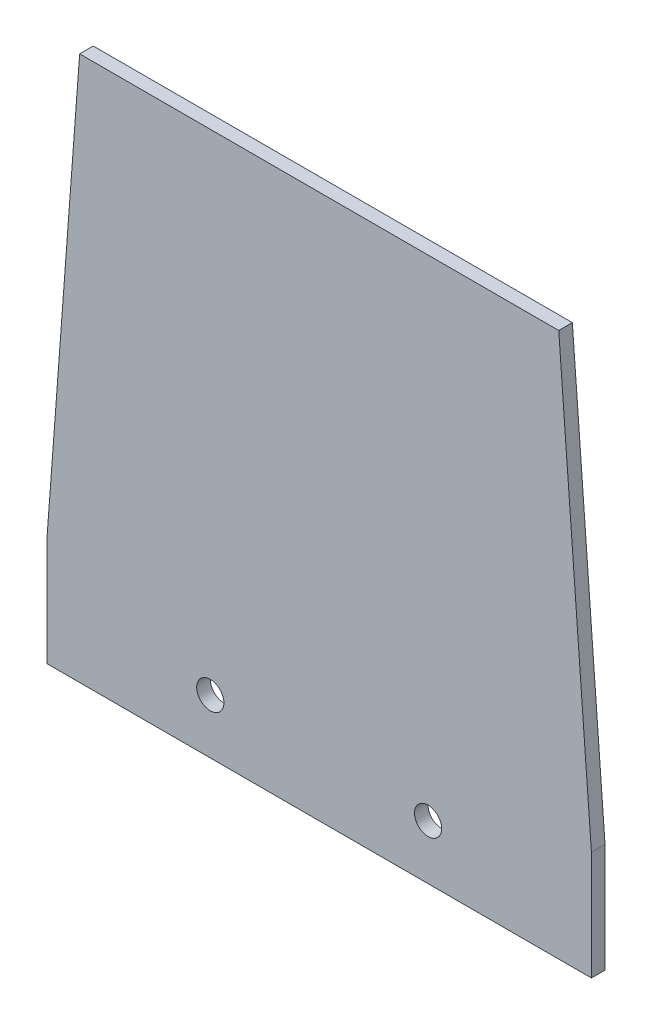
ISO-10303-21;
HEADER;
FILE_DESCRIPTION(('STEP AP214'),'2;1');
FILE_NAME('part.step','',(''),(''),'','','');
FILE_SCHEMA(('AUTOMOTIVE_DESIGN { 1 0 10303 214 1 1 1 1 }'));
ENDSEC;
DATA;
#1=APPLICATION_CONTEXT('core data for automotive mechanical design processes');
#2=APPLICATION_PROTOCOL_DEFINITION('international standard','automotive_design',2000,#1);
#3=PRODUCT_CONTEXT('',#1,'mechanical');
#4=PRODUCT('Part','Part','',(#3));
#5=PRODUCT_RELATED_PRODUCT_CATEGORY('part','',(#4));
#6=PRODUCT_DEFINITION_FORMATION('','',#4);
#7=PRODUCT_DEFINITION_CONTEXT('part definition',#1,'design');
#8=PRODUCT_DEFINITION('design','',#6,#7);
#9=PRODUCT_DEFINITION_SHAPE('','',#8);
#10=(LENGTH_UNIT() NAMED_UNIT(*) SI_UNIT(.MILLI.,.METRE.));
#11=(NAMED_UNIT(*) PLANE_ANGLE_UNIT() SI_UNIT($,.RADIAN.));
#12=(NAMED_UNIT(*) SI_UNIT($,.STERADIAN.) SOLID_ANGLE_UNIT());
#13=UNCERTAINTY_MEASURE_WITH_UNIT(LENGTH_MEASURE(1.E-05),#10,'distance_accuracy_value','');
#14=(GEOMETRIC_REPRESENTATION_CONTEXT(3) GLOBAL_UNCERTAINTY_ASSIGNED_CONTEXT((#13)) GLOBAL_UNIT_ASSIGNED_CONTEXT((#10,
#11,#12)) REPRESENTATION_CONTEXT('',''));
#15=CARTESIAN_POINT('',(0.,0.,0.));
#16=DIRECTION('',(0.,0.,1.));
#17=DIRECTION('',(1.,0.,0.));
#18=AXIS2_PLACEMENT_3D('',#15,#16,#17);
#19=CARTESIAN_POINT('',(57.4617775015538,4.30963331261663,3.175));
#20=DIRECTION('',(0.997199309888456,0.074789948241636,0.));
#21=DIRECTION('',(-0.074789948241636,0.997199309888456,0.));
#22=AXIS2_PLACEMENT_3D('',#19,#20,#21);
#23=PLANE('',#22);
#24=DIRECTION('',(0.074789948241636,-0.997199309888456,0.));
#25=VECTOR('',#24,1.);
#26=CARTESIAN_POINT('',(57.4617775015538,4.30963331261663,0.));
#27=LINE('',#26,#25);
#28=CARTESIAN_POINT('',(55.88,25.4,0.));
#29=VERTEX_POINT('',#28);
#30=CARTESIAN_POINT('',(63.5000000000002,-76.2000000000004,0.));
#31=VERTEX_POINT('',#30);
#32=EDGE_CURVE('E116',#29,#31,#27,.T.);
#33=ORIENTED_EDGE('',*,*,#32,.F.);
#34=DIRECTION('',(0.,0.,-1.));
#35=VECTOR('',#34,1.);
#36=CARTESIAN_POINT('',(55.88,25.4,3.175));
#37=LINE('',#36,#35);
#38=CARTESIAN_POINT('',(55.88,25.4,3.175));
#39=VERTEX_POINT('',#38);
#40=EDGE_CURVE('E11',#39,#29,#37,.T.);
#41=ORIENTED_EDGE('',*,*,#40,.F.);
#42=DIRECTION('',(0.074789948241636,-0.997199309888456,0.));
#43=VECTOR('',#42,1.);
#44=CARTESIAN_POINT('',(57.4617775015538,4.30963331261663,3.175));
#45=LINE('',#44,#43);
#46=CARTESIAN_POINT('',(63.5000000000002,-76.2000000000004,3.175));
#47=VERTEX_POINT('',#46);
#48=EDGE_CURVE('E131',#39,#47,#45,.T.);
#49=ORIENTED_EDGE('',*,*,#48,.T.);
#50=DIRECTION('',(0.,0.,-1.));
#51=VECTOR('',#50,1.);
#52=CARTESIAN_POINT('',(63.5000000000002,-76.2000000000004,3.175));
#53=LINE('',#52,#51);
#54=EDGE_CURVE('E51',#47,#31,#53,.T.);
#55=ORIENTED_EDGE('',*,*,#54,.T.);
#56=EDGE_LOOP('',(#33,#41,#49,#55));
#57=FACE_BOUND('',#56,.T.);
#58=ADVANCED_FACE('F35',(#57),#23,.T.);
#59=CARTESIAN_POINT('',(0.,25.4,3.175));
#60=DIRECTION('',(0.,1.,0.));
#61=DIRECTION('',(-1.,0.,0.));
#62=AXIS2_PLACEMENT_3D('',#59,#60,#61);
#63=PLANE('',#62);
#64=DIRECTION('',(1.,0.,0.));
#65=VECTOR('',#64,1.);
#66=CARTESIAN_POINT('',(0.,25.4,0.));
#67=LINE('',#66,#65);
#68=CARTESIAN_POINT('',(-55.88,25.4,0.));
#69=VERTEX_POINT('',#68);
#70=EDGE_CURVE('E118',#69,#29,#67,.T.);
#71=ORIENTED_EDGE('',*,*,#70,.F.);
#72=DIRECTION('',(0.,0.,-1.));
#73=VECTOR('',#72,1.);
#74=CARTESIAN_POINT('',(-55.88,25.4,3.175));
#75=LINE('',#74,#73);
#76=CARTESIAN_POINT('',(-55.88,25.4,3.175));
#77=VERTEX_POINT('',#76);
#78=EDGE_CURVE('E43',#77,#69,#75,.T.);
#79=ORIENTED_EDGE('',*,*,#78,.F.);
#80=DIRECTION('',(1.,0.,0.));
#81=VECTOR('',#80,1.);
#82=CARTESIAN_POINT('',(0.,25.4,3.175));
#83=LINE('',#82,#81);
#84=EDGE_CURVE('E232',#77,#39,#83,.T.);
#85=ORIENTED_EDGE('',*,*,#84,.T.);
#86=ORIENTED_EDGE('',*,*,#40,.T.);
#87=EDGE_LOOP('',(#71,#79,#85,#86));
#88=FACE_BOUND('',#87,.T.);
#89=ADVANCED_FACE('F140',(#88),#63,.T.);
#90=CARTESIAN_POINT('',(-57.4617775015538,4.30963331261638,3.175));
#91=DIRECTION('',(-0.997199309888457,0.0747899482416317,0.));
#92=DIRECTION('',(-0.0747899482416317,-0.997199309888457,0.));
#93=AXIS2_PLACEMENT_3D('',#90,#91,#92);
#94=PLANE('',#93);
#95=DIRECTION('',(0.0747899482416317,0.997199309888457,0.));
#96=VECTOR('',#95,1.);
#97=CARTESIAN_POINT('',(-57.4617775015538,4.30963331261638,0.));
#98=LINE('',#97,#96);
#99=CARTESIAN_POINT('',(-63.4999999999998,-76.2000000000004,0.));
#100=VERTEX_POINT('',#99);
#101=EDGE_CURVE('E122',#100,#69,#98,.T.);
#102=ORIENTED_EDGE('',*,*,#101,.F.);
#103=DIRECTION('',(0.,0.,-1.));
#104=VECTOR('',#103,1.);
#105=CARTESIAN_POINT('',(-63.4999999999998,-76.2000000000004,3.175));
#106=LINE('',#105,#104);
#107=CARTESIAN_POINT('',(-63.4999999999998,-76.2000000000004,3.175));
#108=VERTEX_POINT('',#107);
#109=EDGE_CURVE('E98',#108,#100,#106,.T.);
#110=ORIENTED_EDGE('',*,*,#109,.F.);
#111=DIRECTION('',(0.0747899482416317,0.997199309888457,0.));
#112=VECTOR('',#111,1.);
#113=CARTESIAN_POINT('',(-57.4617775015538,4.30963331261638,3.175));
#114=LINE('',#113,#112);
#115=EDGE_CURVE('E108',#108,#77,#114,.T.);
#116=ORIENTED_EDGE('',*,*,#115,.T.);
#117=ORIENTED_EDGE('',*,*,#78,.T.);
#118=EDGE_LOOP('',(#102,#110,#116,#117));
#119=FACE_BOUND('',#118,.T.);
#120=ADVANCED_FACE('F137',(#119),#94,.T.);
#121=CARTESIAN_POINT('',(-63.4999999999992,5.55111512312582E-13,3.175));
#122=DIRECTION('',(-1.,0.,0.));
#123=DIRECTION('',(0.,-1.,0.));
#124=AXIS2_PLACEMENT_3D('',#121,#122,#123);
#125=PLANE('',#124);
#126=DIRECTION('',(0.,1.,0.));
#127=VECTOR('',#126,1.);
#128=CARTESIAN_POINT('',(-63.4999999999992,5.55111512312582E-13,0.));
#129=LINE('',#128,#127);
#130=CARTESIAN_POINT('',(-63.5,-101.6,0.));
#131=VERTEX_POINT('',#130);
#132=EDGE_CURVE('E94',#131,#100,#129,.T.);
#133=ORIENTED_EDGE('',*,*,#132,.F.);
#134=DIRECTION('',(0.,0.,-1.));
#135=VECTOR('',#134,1.);
#136=CARTESIAN_POINT('',(-63.5,-101.6,3.175));
#137=LINE('',#136,#135);
#138=CARTESIAN_POINT('',(-63.5,-101.6,3.175));
#139=VERTEX_POINT('',#138);
#140=EDGE_CURVE('E89',#139,#131,#137,.T.);
#141=ORIENTED_EDGE('',*,*,#140,.F.);
#142=DIRECTION('',(0.,1.,0.));
#143=VECTOR('',#142,1.);
#144=CARTESIAN_POINT('',(-63.4999999999992,5.55111512312582E-13,3.175));
#145=LINE('',#144,#143);
#146=EDGE_CURVE('E92',#139,#108,#145,.T.);
#147=ORIENTED_EDGE('',*,*,#146,.T.);
#148=ORIENTED_EDGE('',*,*,#109,.T.);
#149=EDGE_LOOP('',(#133,#141,#147,#148));
#150=FACE_BOUND('',#149,.T.);
#151=ADVANCED_FACE('F91',(#150),#125,.T.);
#152=CARTESIAN_POINT('',(0.,-101.6,3.175));
#153=DIRECTION('',(0.,-1.,0.));
#154=DIRECTION('',(0.,0.,-1.));
#155=AXIS2_PLACEMENT_3D('',#152,#153,#154);
#156=PLANE('',#155);
#157=DIRECTION('',(-1.,0.,0.));
#158=VECTOR('',#157,1.);
#159=CARTESIAN_POINT('',(0.,-101.6,0.));
#160=LINE('',#159,#158);
#161=CARTESIAN_POINT('',(63.4999999999999,-101.6,0.));
#162=VERTEX_POINT('',#161);
#163=EDGE_CURVE('E126',#162,#131,#160,.T.);
#164=ORIENTED_EDGE('',*,*,#163,.F.);
#165=DIRECTION('',(0.,0.,-1.));
#166=VECTOR('',#165,1.);
#167=CARTESIAN_POINT('',(63.4999999999999,-101.6,3.175));
#168=LINE('',#167,#166);
#169=CARTESIAN_POINT('',(63.4999999999999,-101.6,3.175));
#170=VERTEX_POINT('',#169);
#171=EDGE_CURVE('E70',#170,#162,#168,.T.);
#172=ORIENTED_EDGE('',*,*,#171,.F.);
#173=DIRECTION('',(-1.,0.,0.));
#174=VECTOR('',#173,1.);
#175=CARTESIAN_POINT('',(0.,-101.6,3.175));
#176=LINE('',#175,#174);
#177=EDGE_CURVE('E105',#170,#139,#176,.T.);
#178=ORIENTED_EDGE('',*,*,#177,.T.);
#179=ORIENTED_EDGE('',*,*,#140,.T.);
#180=EDGE_LOOP('',(#164,#172,#178,#179));
#181=FACE_BOUND('',#180,.T.);
#182=ADVANCED_FACE('F110',(#181),#156,.T.);
#183=CARTESIAN_POINT('',(63.500000000001,-6.93889390390748E-13,3.175));
#184=DIRECTION('',(1.,0.,0.));
#185=DIRECTION('',(0.,1.,0.));
#186=AXIS2_PLACEMENT_3D('',#183,#184,#185);
#187=PLANE('',#186);
#188=DIRECTION('',(0.,-1.,0.));
#189=VECTOR('',#188,1.);
#190=CARTESIAN_POINT('',(63.500000000001,-6.93889390390748E-13,0.));
#191=LINE('',#190,#189);
#192=EDGE_CURVE('E128',#31,#162,#191,.T.);
#193=ORIENTED_EDGE('',*,*,#192,.F.);
#194=ORIENTED_EDGE('',*,*,#54,.F.);
#195=DIRECTION('',(0.,-1.,0.));
#196=VECTOR('',#195,1.);
#197=CARTESIAN_POINT('',(63.500000000001,-6.93889390390748E-13,3.175));
#198=LINE('',#197,#196);
#199=EDGE_CURVE('E111',#47,#170,#198,.T.);
#200=ORIENTED_EDGE('',*,*,#199,.T.);
#201=ORIENTED_EDGE('',*,*,#171,.T.);
#202=EDGE_LOOP('',(#193,#194,#200,#201));
#203=FACE_BOUND('',#202,.T.);
#204=ADVANCED_FACE('F143',(#203),#187,.T.);
#205=CARTESIAN_POINT('',(0.,0.,3.175));
#206=DIRECTION('',(0.,0.,1.));
#207=DIRECTION('',(1.,0.,0.));
#208=AXIS2_PLACEMENT_3D('',#205,#206,#207);
#209=PLANE('',#208);
#210=CARTESIAN_POINT('',(25.4,-88.9,3.175));
#211=DIRECTION('',(0.,0.,1.));
#212=DIRECTION('',(1.,0.,0.));
#213=AXIS2_PLACEMENT_3D('',#210,#211,#212);
#214=CIRCLE('',#213,3.175);
#215=CARTESIAN_POINT('',(28.575,-88.9,3.175));
#216=VERTEX_POINT('',#215);
#217=EDGE_CURVE('E222',#216,#216,#214,.T.);
#218=ORIENTED_EDGE('',*,*,#217,.F.);
#219=EDGE_LOOP('',(#218));
#220=FACE_BOUND('',#219,.T.);
#221=CARTESIAN_POINT('',(-25.4,-88.9,3.175));
#222=DIRECTION('',(0.,0.,1.));
#223=DIRECTION('',(1.,0.,0.));
#224=AXIS2_PLACEMENT_3D('',#221,#222,#223);
#225=CIRCLE('',#224,3.175);
#226=CARTESIAN_POINT('',(-22.225,-88.9,3.175));
#227=VERTEX_POINT('',#226);
#228=EDGE_CURVE('E224',#227,#227,#225,.T.);
#229=ORIENTED_EDGE('',*,*,#228,.F.);
#230=EDGE_LOOP('',(#229));
#231=FACE_BOUND('',#230,.T.);
#232=ORIENTED_EDGE('',*,*,#48,.F.);
#233=ORIENTED_EDGE('',*,*,#84,.F.);
#234=ORIENTED_EDGE('',*,*,#115,.F.);
#235=ORIENTED_EDGE('',*,*,#146,.F.);
#236=ORIENTED_EDGE('',*,*,#177,.F.);
#237=ORIENTED_EDGE('',*,*,#199,.F.);
#238=EDGE_LOOP('',(#232,#233,#234,#235,#236,#237));
#239=FACE_BOUND('',#238,.T.);
#240=ADVANCED_FACE('F103',(#220,#231,#239),#209,.T.);
#241=CARTESIAN_POINT('',(0.,0.,0.));
#242=DIRECTION('',(0.,0.,1.));
#243=DIRECTION('',(1.,0.,0.));
#244=AXIS2_PLACEMENT_3D('',#241,#242,#243);
#245=PLANE('',#244);
#246=CARTESIAN_POINT('',(25.4,-88.9,0.));
#247=DIRECTION('',(0.,0.,1.));
#248=DIRECTION('',(1.,0.,0.));
#249=AXIS2_PLACEMENT_3D('',#246,#247,#248);
#250=CIRCLE('',#249,3.175);
#251=CARTESIAN_POINT('',(28.575,-88.9,0.));
#252=VERTEX_POINT('',#251);
#253=EDGE_CURVE('E219',#252,#252,#250,.T.);
#254=ORIENTED_EDGE('',*,*,#253,.T.);
#255=EDGE_LOOP('',(#254));
#256=FACE_BOUND('',#255,.T.);
#257=CARTESIAN_POINT('',(-25.4,-88.9,0.));
#258=DIRECTION('',(0.,0.,1.));
#259=DIRECTION('',(1.,0.,0.));
#260=AXIS2_PLACEMENT_3D('',#257,#258,#259);
#261=CIRCLE('',#260,3.175);
#262=CARTESIAN_POINT('',(-22.225,-88.9,0.));
#263=VERTEX_POINT('',#262);
#264=EDGE_CURVE('E119',#263,#263,#261,.T.);
#265=ORIENTED_EDGE('',*,*,#264,.T.);
#266=EDGE_LOOP('',(#265));
#267=FACE_BOUND('',#266,.T.);
#268=ORIENTED_EDGE('',*,*,#32,.T.);
#269=ORIENTED_EDGE('',*,*,#192,.T.);
#270=ORIENTED_EDGE('',*,*,#163,.T.);
#271=ORIENTED_EDGE('',*,*,#132,.T.);
#272=ORIENTED_EDGE('',*,*,#101,.T.);
#273=ORIENTED_EDGE('',*,*,#70,.T.);
#274=EDGE_LOOP('',(#268,#269,#270,#271,#272,#273));
#275=FACE_BOUND('',#274,.T.);
#276=ADVANCED_FACE('F142',(#256,#267,#275),#245,.F.);
#277=CARTESIAN_POINT('',(-25.4,-88.9,0.));
#278=DIRECTION('',(0.,0.,1.));
#279=DIRECTION('',(1.,0.,0.));
#280=AXIS2_PLACEMENT_3D('',#277,#278,#279);
#281=CYLINDRICAL_SURFACE('',#280,3.175);
#282=ORIENTED_EDGE('',*,*,#264,.F.);
#283=EDGE_LOOP('',(#282));
#284=FACE_BOUND('',#283,.T.);
#285=ORIENTED_EDGE('',*,*,#228,.T.);
#286=EDGE_LOOP('',(#285));
#287=FACE_BOUND('',#286,.T.);
#288=ADVANCED_FACE('F193',(#284,#287),#281,.F.);
#289=CARTESIAN_POINT('',(25.4,-88.9,0.));
#290=DIRECTION('',(0.,0.,1.));
#291=DIRECTION('',(1.,0.,0.));
#292=AXIS2_PLACEMENT_3D('',#289,#290,#291);
#293=CYLINDRICAL_SURFACE('',#292,3.175);
#294=ORIENTED_EDGE('',*,*,#253,.F.);
#295=EDGE_LOOP('',(#294));
#296=FACE_BOUND('',#295,.T.);
#297=ORIENTED_EDGE('',*,*,#217,.T.);
#298=EDGE_LOOP('',(#297));
#299=FACE_BOUND('',#298,.T.);
#300=ADVANCED_FACE('F202',(#296,#299),#293,.F.);
#301=CLOSED_SHELL('',(#58,#89,#120,#151,#182,#204,#240,#276,#288,#300));
#302=MANIFOLD_SOLID_BREP('B2',#301);
#303=ADVANCED_BREP_SHAPE_REPRESENTATION('',(#18,#302),#14);
#304=SHAPE_DEFINITION_REPRESENTATION(#9,#303);
ENDSEC;
END-ISO-10303-21;
